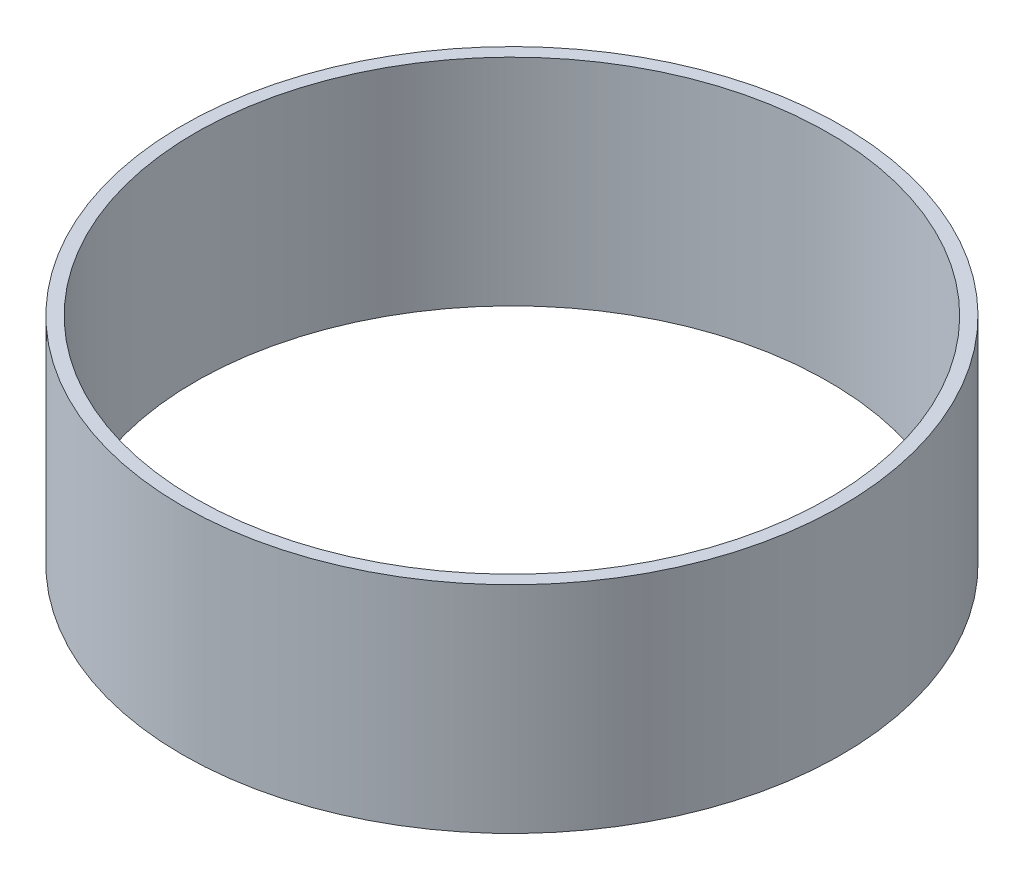
ISO-10303-21;
HEADER;
FILE_DESCRIPTION(('STEP AP214'),'2;1');
FILE_NAME('part.step','',(''),(''),'','','');
FILE_SCHEMA(('AUTOMOTIVE_DESIGN { 1 0 10303 214 1 1 1 1 }'));
ENDSEC;
DATA;
#1=APPLICATION_CONTEXT('core data for automotive mechanical design processes');
#2=APPLICATION_PROTOCOL_DEFINITION('international standard','automotive_design',2000,#1);
#3=PRODUCT_CONTEXT('',#1,'mechanical');
#4=PRODUCT('Part','Part','',(#3));
#5=PRODUCT_RELATED_PRODUCT_CATEGORY('part','',(#4));
#6=PRODUCT_DEFINITION_FORMATION('','',#4);
#7=PRODUCT_DEFINITION_CONTEXT('part definition',#1,'design');
#8=PRODUCT_DEFINITION('design','',#6,#7);
#9=PRODUCT_DEFINITION_SHAPE('','',#8);
#10=(LENGTH_UNIT() NAMED_UNIT(*) SI_UNIT(.MILLI.,.METRE.));
#11=(NAMED_UNIT(*) PLANE_ANGLE_UNIT() SI_UNIT($,.RADIAN.));
#12=(NAMED_UNIT(*) SI_UNIT($,.STERADIAN.) SOLID_ANGLE_UNIT());
#13=UNCERTAINTY_MEASURE_WITH_UNIT(LENGTH_MEASURE(1.E-05),#10,'distance_accuracy_value','');
#14=(GEOMETRIC_REPRESENTATION_CONTEXT(3) GLOBAL_UNCERTAINTY_ASSIGNED_CONTEXT((#13)) GLOBAL_UNIT_ASSIGNED_CONTEXT((#10,
#11,#12)) REPRESENTATION_CONTEXT('',''));
#15=CARTESIAN_POINT('',(0.,0.,0.));
#16=DIRECTION('',(0.,0.,1.));
#17=DIRECTION('',(1.,0.,0.));
#18=AXIS2_PLACEMENT_3D('',#15,#16,#17);
#19=CARTESIAN_POINT('',(0.,5.,0.));
#20=DIRECTION('',(0.,1.,0.));
#21=DIRECTION('',(0.,0.,1.));
#22=AXIS2_PLACEMENT_3D('',#19,#20,#21);
#23=PLANE('',#22);
#24=CARTESIAN_POINT('',(0.,5.,0.));
#25=DIRECTION('',(0.,1.,0.));
#26=DIRECTION('',(0.,0.,1.));
#27=AXIS2_PLACEMENT_3D('',#24,#25,#26);
#28=CIRCLE('',#27,7.65);
#29=CARTESIAN_POINT('',(0.,5.,7.65));
#30=VERTEX_POINT('',#29);
#31=EDGE_CURVE('E10',#30,#30,#28,.T.);
#32=ORIENTED_EDGE('',*,*,#31,.T.);
#33=EDGE_LOOP('',(#32));
#34=FACE_BOUND('',#33,.T.);
#35=CARTESIAN_POINT('',(0.,5.,0.));
#36=DIRECTION('',(0.,1.,0.));
#37=DIRECTION('',(0.,0.,1.));
#38=AXIS2_PLACEMENT_3D('',#35,#36,#37);
#39=CIRCLE('',#38,7.35);
#40=CARTESIAN_POINT('',(0.,5.,7.35));
#41=VERTEX_POINT('',#40);
#42=EDGE_CURVE('E44',#41,#41,#39,.T.);
#43=ORIENTED_EDGE('',*,*,#42,.F.);
#44=EDGE_LOOP('',(#43));
#45=FACE_BOUND('',#44,.T.);
#46=ADVANCED_FACE('F33',(#34,#45),#23,.T.);
#47=CARTESIAN_POINT('',(0.,0.,0.));
#48=DIRECTION('',(0.,1.,0.));
#49=DIRECTION('',(0.,0.,1.));
#50=AXIS2_PLACEMENT_3D('',#47,#48,#49);
#51=PLANE('',#50);
#52=CARTESIAN_POINT('',(0.,0.,0.));
#53=DIRECTION('',(0.,1.,0.));
#54=DIRECTION('',(0.,0.,1.));
#55=AXIS2_PLACEMENT_3D('',#52,#53,#54);
#56=CIRCLE('',#55,7.65);
#57=CARTESIAN_POINT('',(0.,0.,7.65));
#58=VERTEX_POINT('',#57);
#59=EDGE_CURVE('E37',#58,#58,#56,.T.);
#60=ORIENTED_EDGE('',*,*,#59,.F.);
#61=EDGE_LOOP('',(#60));
#62=FACE_BOUND('',#61,.T.);
#63=CARTESIAN_POINT('',(0.,0.,0.));
#64=DIRECTION('',(0.,1.,0.));
#65=DIRECTION('',(0.,0.,1.));
#66=AXIS2_PLACEMENT_3D('',#63,#64,#65);
#67=CIRCLE('',#66,7.35);
#68=CARTESIAN_POINT('',(0.,0.,7.35));
#69=VERTEX_POINT('',#68);
#70=EDGE_CURVE('E46',#69,#69,#67,.T.);
#71=ORIENTED_EDGE('',*,*,#70,.T.);
#72=EDGE_LOOP('',(#71));
#73=FACE_BOUND('',#72,.T.);
#74=ADVANCED_FACE('F56',(#62,#73),#51,.F.);
#75=CARTESIAN_POINT('',(0.,5.,0.));
#76=DIRECTION('',(0.,-1.,0.));
#77=DIRECTION('',(0.,0.,-1.));
#78=AXIS2_PLACEMENT_3D('',#75,#76,#77);
#79=CYLINDRICAL_SURFACE('',#78,7.65);
#80=ORIENTED_EDGE('',*,*,#31,.F.);
#81=EDGE_LOOP('',(#80));
#82=FACE_BOUND('',#81,.T.);
#83=ORIENTED_EDGE('',*,*,#59,.T.);
#84=EDGE_LOOP('',(#83));
#85=FACE_BOUND('',#84,.T.);
#86=ADVANCED_FACE('F35',(#82,#85),#79,.T.);
#87=CARTESIAN_POINT('',(0.,5.,0.));
#88=DIRECTION('',(0.,-1.,0.));
#89=DIRECTION('',(0.,0.,-1.));
#90=AXIS2_PLACEMENT_3D('',#87,#88,#89);
#91=CYLINDRICAL_SURFACE('',#90,7.35);
#92=ORIENTED_EDGE('',*,*,#42,.T.);
#93=EDGE_LOOP('',(#92));
#94=FACE_BOUND('',#93,.T.);
#95=ORIENTED_EDGE('',*,*,#70,.F.);
#96=EDGE_LOOP('',(#95));
#97=FACE_BOUND('',#96,.T.);
#98=ADVANCED_FACE('F52',(#94,#97),#91,.F.);
#99=CLOSED_SHELL('',(#46,#74,#86,#98));
#100=MANIFOLD_SOLID_BREP('B2',#99);
#101=ADVANCED_BREP_SHAPE_REPRESENTATION('',(#18,#100),#14);
#102=SHAPE_DEFINITION_REPRESENTATION(#9,#101);
ENDSEC;
END-ISO-10303-21;
